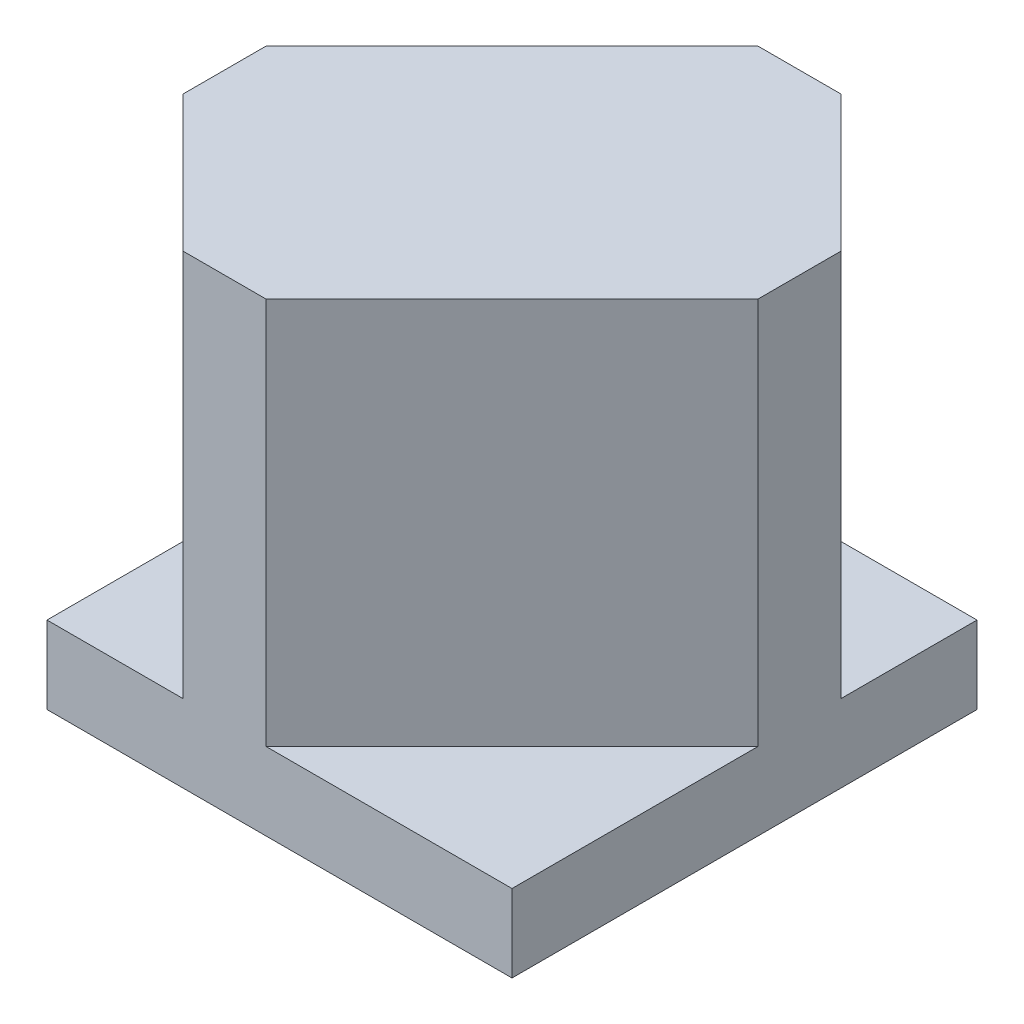
ISO-10303-21;
HEADER;
FILE_DESCRIPTION(('STEP AP214'),'2;1');
FILE_NAME('part.step','',(''),(''),'','','');
FILE_SCHEMA(('AUTOMOTIVE_DESIGN { 1 0 10303 214 1 1 1 1 }'));
ENDSEC;
DATA;
#1=APPLICATION_CONTEXT('core data for automotive mechanical design processes');
#2=APPLICATION_PROTOCOL_DEFINITION('international standard','automotive_design',2000,#1);
#3=PRODUCT_CONTEXT('',#1,'mechanical');
#4=PRODUCT('Part','Part','',(#3));
#5=PRODUCT_RELATED_PRODUCT_CATEGORY('part','',(#4));
#6=PRODUCT_DEFINITION_FORMATION('','',#4);
#7=PRODUCT_DEFINITION_CONTEXT('part definition',#1,'design');
#8=PRODUCT_DEFINITION('design','',#6,#7);
#9=PRODUCT_DEFINITION_SHAPE('','',#8);
#10=(LENGTH_UNIT() NAMED_UNIT(*) SI_UNIT(.MILLI.,.METRE.));
#11=(NAMED_UNIT(*) PLANE_ANGLE_UNIT() SI_UNIT($,.RADIAN.));
#12=(NAMED_UNIT(*) SI_UNIT($,.STERADIAN.) SOLID_ANGLE_UNIT());
#13=UNCERTAINTY_MEASURE_WITH_UNIT(LENGTH_MEASURE(1.E-05),#10,'distance_accuracy_value','');
#14=(GEOMETRIC_REPRESENTATION_CONTEXT(3) GLOBAL_UNCERTAINTY_ASSIGNED_CONTEXT((#13)) GLOBAL_UNIT_ASSIGNED_CONTEXT((#10,
#11,#12)) REPRESENTATION_CONTEXT('',''));
#15=CARTESIAN_POINT('',(0.,0.,0.));
#16=DIRECTION('',(0.,0.,1.));
#17=DIRECTION('',(1.,0.,0.));
#18=AXIS2_PLACEMENT_3D('',#15,#16,#17);
#19=CARTESIAN_POINT('',(30.,60.,0.));
#20=DIRECTION('',(-1.,0.,0.));
#21=DIRECTION('',(0.,0.,1.));
#22=AXIS2_PLACEMENT_3D('',#19,#20,#21);
#23=PLANE('',#22);
#24=DIRECTION('',(0.,0.,-1.));
#25=VECTOR('',#24,1.);
#26=CARTESIAN_POINT('',(30.,0.,0.));
#27=LINE('',#26,#25);
#28=CARTESIAN_POINT('',(30.,0.,30.));
#29=VERTEX_POINT('',#28);
#30=CARTESIAN_POINT('',(30.,0.,-30.));
#31=VERTEX_POINT('',#30);
#32=EDGE_CURVE('E275',#29,#31,#27,.T.);
#33=ORIENTED_EDGE('',*,*,#32,.T.);
#34=DIRECTION('',(0.,-1.,0.));
#35=VECTOR('',#34,1.);
#36=CARTESIAN_POINT('',(30.,10.,-30.));
#37=LINE('',#36,#35);
#38=CARTESIAN_POINT('',(30.,10.,-30.));
#39=VERTEX_POINT('',#38);
#40=EDGE_CURVE('E202',#39,#31,#37,.T.);
#41=ORIENTED_EDGE('',*,*,#40,.F.);
#42=DIRECTION('',(0.,0.,-1.));
#43=VECTOR('',#42,1.);
#44=CARTESIAN_POINT('',(30.,10.,0.));
#45=LINE('',#44,#43);
#46=CARTESIAN_POINT('',(30.,10.,-12.4264068711929));
#47=VERTEX_POINT('',#46);
#48=EDGE_CURVE('E203',#47,#39,#45,.T.);
#49=ORIENTED_EDGE('',*,*,#48,.F.);
#50=DIRECTION('',(0.,-1.,0.));
#51=VECTOR('',#50,1.);
#52=CARTESIAN_POINT('',(30.,60.,-12.4264068711929));
#53=LINE('',#52,#51);
#54=CARTESIAN_POINT('',(30.,60.,-12.4264068711929));
#55=VERTEX_POINT('',#54);
#56=EDGE_CURVE('E12',#55,#47,#53,.T.);
#57=ORIENTED_EDGE('',*,*,#56,.F.);
#58=DIRECTION('',(0.,0.,-1.));
#59=VECTOR('',#58,1.);
#60=CARTESIAN_POINT('',(30.,60.,0.));
#61=LINE('',#60,#59);
#62=CARTESIAN_POINT('',(30.,60.,-1.7157287525381));
#63=VERTEX_POINT('',#62);
#64=EDGE_CURVE('E249',#63,#55,#61,.T.);
#65=ORIENTED_EDGE('',*,*,#64,.F.);
#66=DIRECTION('',(0.,-1.,0.));
#67=VECTOR('',#66,1.);
#68=CARTESIAN_POINT('',(30.,60.,-1.7157287525381));
#69=LINE('',#68,#67);
#70=CARTESIAN_POINT('',(30.,10.,-1.7157287525381));
#71=VERTEX_POINT('',#70);
#72=EDGE_CURVE('E246',#63,#71,#69,.T.);
#73=ORIENTED_EDGE('',*,*,#72,.T.);
#74=DIRECTION('',(0.,0.,-1.));
#75=VECTOR('',#74,1.);
#76=CARTESIAN_POINT('',(30.,10.,0.));
#77=LINE('',#76,#75);
#78=CARTESIAN_POINT('',(30.,10.,30.));
#79=VERTEX_POINT('',#78);
#80=EDGE_CURVE('E224',#79,#71,#77,.T.);
#81=ORIENTED_EDGE('',*,*,#80,.F.);
#82=DIRECTION('',(0.,-1.,0.));
#83=VECTOR('',#82,1.);
#84=CARTESIAN_POINT('',(30.,10.,30.));
#85=LINE('',#84,#83);
#86=EDGE_CURVE('E214',#79,#29,#85,.T.);
#87=ORIENTED_EDGE('',*,*,#86,.T.);
#88=EDGE_LOOP('',(#33,#41,#49,#57,#65,#73,#81,#87));
#89=FACE_BOUND('',#88,.T.);
#90=ADVANCED_FACE('F53',(#89),#23,.F.);
#91=CARTESIAN_POINT('',(21.2132034355964,60.,-21.2132034355964));
#92=DIRECTION('',(-0.707106781186547,0.,0.707106781186548));
#93=DIRECTION('',(0.707106781186548,0.,0.707106781186547));
#94=AXIS2_PLACEMENT_3D('',#91,#92,#93);
#95=PLANE('',#94);
#96=ORIENTED_EDGE('',*,*,#56,.T.);
#97=DIRECTION('',(-0.707106781186548,0.,-0.707106781186547));
#98=VECTOR('',#97,1.);
#99=CARTESIAN_POINT('',(21.2132034355964,10.,-21.2132034355964));
#100=LINE('',#99,#98);
#101=CARTESIAN_POINT('',(12.4264068711929,10.,-30.));
#102=VERTEX_POINT('',#101);
#103=EDGE_CURVE('E165',#47,#102,#100,.T.);
#104=ORIENTED_EDGE('',*,*,#103,.T.);
#105=DIRECTION('',(0.,-1.,0.));
#106=VECTOR('',#105,1.);
#107=CARTESIAN_POINT('',(12.4264068711929,60.,-30.));
#108=LINE('',#107,#106);
#109=CARTESIAN_POINT('',(12.4264068711929,60.,-30.));
#110=VERTEX_POINT('',#109);
#111=EDGE_CURVE('E61',#110,#102,#108,.T.);
#112=ORIENTED_EDGE('',*,*,#111,.F.);
#113=DIRECTION('',(-0.707106781186548,0.,-0.707106781186547));
#114=VECTOR('',#113,1.);
#115=CARTESIAN_POINT('',(21.2132034355964,60.,-21.2132034355964));
#116=LINE('',#115,#114);
#117=EDGE_CURVE('E277',#55,#110,#116,.T.);
#118=ORIENTED_EDGE('',*,*,#117,.F.);
#119=EDGE_LOOP('',(#96,#104,#112,#118));
#120=FACE_BOUND('',#119,.T.);
#121=ADVANCED_FACE('F296',(#120),#95,.F.);
#122=CARTESIAN_POINT('',(0.,60.,-30.));
#123=DIRECTION('',(0.,0.,-1.));
#124=DIRECTION('',(-1.,0.,0.));
#125=AXIS2_PLACEMENT_3D('',#122,#123,#124);
#126=PLANE('',#125);
#127=DIRECTION('',(1.,0.,0.));
#128=VECTOR('',#127,1.);
#129=CARTESIAN_POINT('',(0.,0.,-30.));
#130=LINE('',#129,#128);
#131=CARTESIAN_POINT('',(-30.,0.,-30.));
#132=VERTEX_POINT('',#131);
#133=EDGE_CURVE('E288',#132,#31,#130,.T.);
#134=ORIENTED_EDGE('',*,*,#133,.F.);
#135=DIRECTION('',(0.,-1.,0.));
#136=VECTOR('',#135,1.);
#137=CARTESIAN_POINT('',(-30.,10.,-30.));
#138=LINE('',#137,#136);
#139=CARTESIAN_POINT('',(-30.,10.,-30.));
#140=VERTEX_POINT('',#139);
#141=EDGE_CURVE('E163',#140,#132,#138,.T.);
#142=ORIENTED_EDGE('',*,*,#141,.F.);
#143=DIRECTION('',(1.,0.,0.));
#144=VECTOR('',#143,1.);
#145=CARTESIAN_POINT('',(0.,10.,-30.));
#146=LINE('',#145,#144);
#147=CARTESIAN_POINT('',(1.71572875253808,10.,-30.));
#148=VERTEX_POINT('',#147);
#149=EDGE_CURVE('E156',#140,#148,#146,.T.);
#150=ORIENTED_EDGE('',*,*,#149,.T.);
#151=DIRECTION('',(0.,-1.,0.));
#152=VECTOR('',#151,1.);
#153=CARTESIAN_POINT('',(1.71572875253808,60.,-30.));
#154=LINE('',#153,#152);
#155=CARTESIAN_POINT('',(1.71572875253808,60.,-30.));
#156=VERTEX_POINT('',#155);
#157=EDGE_CURVE('E142',#156,#148,#154,.T.);
#158=ORIENTED_EDGE('',*,*,#157,.F.);
#159=DIRECTION('',(1.,0.,0.));
#160=VECTOR('',#159,1.);
#161=CARTESIAN_POINT('',(0.,60.,-30.));
#162=LINE('',#161,#160);
#163=EDGE_CURVE('E279',#156,#110,#162,.T.);
#164=ORIENTED_EDGE('',*,*,#163,.T.);
#165=ORIENTED_EDGE('',*,*,#111,.T.);
#166=DIRECTION('',(1.,0.,0.));
#167=VECTOR('',#166,1.);
#168=CARTESIAN_POINT('',(0.,10.,-30.));
#169=LINE('',#168,#167);
#170=EDGE_CURVE('E77',#102,#39,#169,.T.);
#171=ORIENTED_EDGE('',*,*,#170,.T.);
#172=ORIENTED_EDGE('',*,*,#40,.T.);
#173=EDGE_LOOP('',(#134,#142,#150,#158,#164,#165,#171,#172));
#174=FACE_BOUND('',#173,.T.);
#175=ADVANCED_FACE('F161',(#174),#126,.T.);
#176=CARTESIAN_POINT('',(-14.142135623731,60.,-14.142135623731));
#177=DIRECTION('',(-0.707106781186548,0.,-0.707106781186547));
#178=DIRECTION('',(-0.707106781186547,0.,0.707106781186548));
#179=AXIS2_PLACEMENT_3D('',#176,#177,#178);
#180=PLANE('',#179);
#181=DIRECTION('',(0.707106781186547,0.,-0.707106781186548));
#182=VECTOR('',#181,1.);
#183=CARTESIAN_POINT('',(-14.142135623731,10.,-14.142135623731));
#184=LINE('',#183,#182);
#185=CARTESIAN_POINT('',(-30.,10.,1.71572875253812));
#186=VERTEX_POINT('',#185);
#187=EDGE_CURVE('E69',#186,#148,#184,.T.);
#188=ORIENTED_EDGE('',*,*,#187,.F.);
#189=DIRECTION('',(0.,-1.,0.));
#190=VECTOR('',#189,1.);
#191=CARTESIAN_POINT('',(-30.,60.,1.71572875253812));
#192=LINE('',#191,#190);
#193=CARTESIAN_POINT('',(-30.,60.,1.71572875253812));
#194=VERTEX_POINT('',#193);
#195=EDGE_CURVE('E150',#194,#186,#192,.T.);
#196=ORIENTED_EDGE('',*,*,#195,.F.);
#197=DIRECTION('',(0.707106781186547,0.,-0.707106781186548));
#198=VECTOR('',#197,1.);
#199=CARTESIAN_POINT('',(-14.142135623731,60.,-14.142135623731));
#200=LINE('',#199,#198);
#201=EDGE_CURVE('E145',#194,#156,#200,.T.);
#202=ORIENTED_EDGE('',*,*,#201,.T.);
#203=ORIENTED_EDGE('',*,*,#157,.T.);
#204=EDGE_LOOP('',(#188,#196,#202,#203));
#205=FACE_BOUND('',#204,.T.);
#206=ADVANCED_FACE('F143',(#205),#180,.T.);
#207=CARTESIAN_POINT('',(-30.,60.,0.));
#208=DIRECTION('',(-1.,0.,0.));
#209=DIRECTION('',(0.,0.,1.));
#210=AXIS2_PLACEMENT_3D('',#207,#208,#209);
#211=PLANE('',#210);
#212=DIRECTION('',(0.,0.,-1.));
#213=VECTOR('',#212,1.);
#214=CARTESIAN_POINT('',(-30.,0.,0.));
#215=LINE('',#214,#213);
#216=CARTESIAN_POINT('',(-30.,0.,30.));
#217=VERTEX_POINT('',#216);
#218=EDGE_CURVE('E289',#217,#132,#215,.T.);
#219=ORIENTED_EDGE('',*,*,#218,.F.);
#220=DIRECTION('',(0.,-1.,0.));
#221=VECTOR('',#220,1.);
#222=CARTESIAN_POINT('',(-30.,10.,30.));
#223=LINE('',#222,#221);
#224=CARTESIAN_POINT('',(-30.,10.,30.));
#225=VERTEX_POINT('',#224);
#226=EDGE_CURVE('E273',#225,#217,#223,.T.);
#227=ORIENTED_EDGE('',*,*,#226,.F.);
#228=DIRECTION('',(0.,0.,-1.));
#229=VECTOR('',#228,1.);
#230=CARTESIAN_POINT('',(-30.,10.,0.));
#231=LINE('',#230,#229);
#232=CARTESIAN_POINT('',(-30.,10.,12.4264068711929));
#233=VERTEX_POINT('',#232);
#234=EDGE_CURVE('E269',#225,#233,#231,.T.);
#235=ORIENTED_EDGE('',*,*,#234,.T.);
#236=DIRECTION('',(0.,-1.,0.));
#237=VECTOR('',#236,1.);
#238=CARTESIAN_POINT('',(-30.,60.,12.4264068711929));
#239=LINE('',#238,#237);
#240=CARTESIAN_POINT('',(-30.,60.,12.4264068711929));
#241=VERTEX_POINT('',#240);
#242=EDGE_CURVE('E176',#241,#233,#239,.T.);
#243=ORIENTED_EDGE('',*,*,#242,.F.);
#244=DIRECTION('',(0.,0.,-1.));
#245=VECTOR('',#244,1.);
#246=CARTESIAN_POINT('',(-30.,60.,0.));
#247=LINE('',#246,#245);
#248=EDGE_CURVE('E175',#241,#194,#247,.T.);
#249=ORIENTED_EDGE('',*,*,#248,.T.);
#250=ORIENTED_EDGE('',*,*,#195,.T.);
#251=DIRECTION('',(0.,0.,-1.));
#252=VECTOR('',#251,1.);
#253=CARTESIAN_POINT('',(-30.,10.,0.));
#254=LINE('',#253,#252);
#255=EDGE_CURVE('E158',#186,#140,#254,.T.);
#256=ORIENTED_EDGE('',*,*,#255,.T.);
#257=ORIENTED_EDGE('',*,*,#141,.T.);
#258=EDGE_LOOP('',(#219,#227,#235,#243,#249,#250,#256,#257));
#259=FACE_BOUND('',#258,.T.);
#260=ADVANCED_FACE('F172',(#259),#211,.T.);
#261=CARTESIAN_POINT('',(-21.2132034355964,60.,21.2132034355965));
#262=DIRECTION('',(-0.707106781186547,0.,0.707106781186548));
#263=DIRECTION('',(0.707106781186548,0.,0.707106781186547));
#264=AXIS2_PLACEMENT_3D('',#261,#262,#263);
#265=PLANE('',#264);
#266=DIRECTION('',(-0.707106781186548,0.,-0.707106781186547));
#267=VECTOR('',#266,1.);
#268=CARTESIAN_POINT('',(-21.2132034355964,10.,21.2132034355965));
#269=LINE('',#268,#267);
#270=CARTESIAN_POINT('',(-12.4264068711929,10.,30.));
#271=VERTEX_POINT('',#270);
#272=EDGE_CURVE('E266',#271,#233,#269,.T.);
#273=ORIENTED_EDGE('',*,*,#272,.F.);
#274=DIRECTION('',(0.,-1.,0.));
#275=VECTOR('',#274,1.);
#276=CARTESIAN_POINT('',(-12.4264068711929,60.,30.));
#277=LINE('',#276,#275);
#278=CARTESIAN_POINT('',(-12.4264068711929,60.,30.));
#279=VERTEX_POINT('',#278);
#280=EDGE_CURVE('E178',#279,#271,#277,.T.);
#281=ORIENTED_EDGE('',*,*,#280,.F.);
#282=DIRECTION('',(-0.707106781186548,0.,-0.707106781186547));
#283=VECTOR('',#282,1.);
#284=CARTESIAN_POINT('',(-21.2132034355964,60.,21.2132034355965));
#285=LINE('',#284,#283);
#286=EDGE_CURVE('E283',#279,#241,#285,.T.);
#287=ORIENTED_EDGE('',*,*,#286,.T.);
#288=ORIENTED_EDGE('',*,*,#242,.T.);
#289=EDGE_LOOP('',(#273,#281,#287,#288));
#290=FACE_BOUND('',#289,.T.);
#291=ADVANCED_FACE('F305',(#290),#265,.T.);
#292=CARTESIAN_POINT('',(0.,60.,30.));
#293=DIRECTION('',(0.,0.,-1.));
#294=DIRECTION('',(-1.,0.,0.));
#295=AXIS2_PLACEMENT_3D('',#292,#293,#294);
#296=PLANE('',#295);
#297=DIRECTION('',(1.,0.,0.));
#298=VECTOR('',#297,1.);
#299=CARTESIAN_POINT('',(0.,0.,30.));
#300=LINE('',#299,#298);
#301=EDGE_CURVE('E239',#217,#29,#300,.T.);
#302=ORIENTED_EDGE('',*,*,#301,.T.);
#303=ORIENTED_EDGE('',*,*,#86,.F.);
#304=DIRECTION('',(1.,0.,0.));
#305=VECTOR('',#304,1.);
#306=CARTESIAN_POINT('',(0.,10.,30.));
#307=LINE('',#306,#305);
#308=CARTESIAN_POINT('',(-1.71572875253808,10.,30.));
#309=VERTEX_POINT('',#308);
#310=EDGE_CURVE('E220',#309,#79,#307,.T.);
#311=ORIENTED_EDGE('',*,*,#310,.F.);
#312=DIRECTION('',(0.,-1.,0.));
#313=VECTOR('',#312,1.);
#314=CARTESIAN_POINT('',(-1.71572875253808,60.,30.));
#315=LINE('',#314,#313);
#316=CARTESIAN_POINT('',(-1.71572875253808,60.,30.));
#317=VERTEX_POINT('',#316);
#318=EDGE_CURVE('E221',#317,#309,#315,.T.);
#319=ORIENTED_EDGE('',*,*,#318,.F.);
#320=DIRECTION('',(1.,0.,0.));
#321=VECTOR('',#320,1.);
#322=CARTESIAN_POINT('',(0.,60.,30.));
#323=LINE('',#322,#321);
#324=EDGE_CURVE('E253',#279,#317,#323,.T.);
#325=ORIENTED_EDGE('',*,*,#324,.F.);
#326=ORIENTED_EDGE('',*,*,#280,.T.);
#327=DIRECTION('',(1.,0.,0.));
#328=VECTOR('',#327,1.);
#329=CARTESIAN_POINT('',(0.,10.,30.));
#330=LINE('',#329,#328);
#331=EDGE_CURVE('E242',#225,#271,#330,.T.);
#332=ORIENTED_EDGE('',*,*,#331,.F.);
#333=ORIENTED_EDGE('',*,*,#226,.T.);
#334=EDGE_LOOP('',(#302,#303,#311,#319,#325,#326,#332,#333));
#335=FACE_BOUND('',#334,.T.);
#336=ADVANCED_FACE('F237',(#335),#296,.F.);
#337=CARTESIAN_POINT('',(14.142135623731,60.,14.142135623731));
#338=DIRECTION('',(-0.707106781186548,0.,-0.707106781186547));
#339=DIRECTION('',(-0.707106781186547,0.,0.707106781186548));
#340=AXIS2_PLACEMENT_3D('',#337,#338,#339);
#341=PLANE('',#340);
#342=ORIENTED_EDGE('',*,*,#318,.T.);
#343=DIRECTION('',(0.707106781186547,0.,-0.707106781186548));
#344=VECTOR('',#343,1.);
#345=CARTESIAN_POINT('',(14.142135623731,10.,14.142135623731));
#346=LINE('',#345,#344);
#347=EDGE_CURVE('E211',#309,#71,#346,.T.);
#348=ORIENTED_EDGE('',*,*,#347,.T.);
#349=ORIENTED_EDGE('',*,*,#72,.F.);
#350=DIRECTION('',(0.707106781186547,0.,-0.707106781186548));
#351=VECTOR('',#350,1.);
#352=CARTESIAN_POINT('',(14.142135623731,60.,14.142135623731));
#353=LINE('',#352,#351);
#354=EDGE_CURVE('E252',#317,#63,#353,.T.);
#355=ORIENTED_EDGE('',*,*,#354,.F.);
#356=EDGE_LOOP('',(#342,#348,#349,#355));
#357=FACE_BOUND('',#356,.T.);
#358=ADVANCED_FACE('F301',(#357),#341,.F.);
#359=CARTESIAN_POINT('',(0.,60.,0.));
#360=DIRECTION('',(0.,1.,0.));
#361=DIRECTION('',(0.,0.,1.));
#362=AXIS2_PLACEMENT_3D('',#359,#360,#361);
#363=PLANE('',#362);
#364=ORIENTED_EDGE('',*,*,#64,.T.);
#365=ORIENTED_EDGE('',*,*,#117,.T.);
#366=ORIENTED_EDGE('',*,*,#163,.F.);
#367=ORIENTED_EDGE('',*,*,#201,.F.);
#368=ORIENTED_EDGE('',*,*,#248,.F.);
#369=ORIENTED_EDGE('',*,*,#286,.F.);
#370=ORIENTED_EDGE('',*,*,#324,.T.);
#371=ORIENTED_EDGE('',*,*,#354,.T.);
#372=EDGE_LOOP('',(#364,#365,#366,#367,#368,#369,#370,#371));
#373=FACE_BOUND('',#372,.T.);
#374=ADVANCED_FACE('F298',(#373),#363,.T.);
#375=CARTESIAN_POINT('',(0.,0.,0.));
#376=DIRECTION('',(0.,1.,0.));
#377=DIRECTION('',(0.,0.,1.));
#378=AXIS2_PLACEMENT_3D('',#375,#376,#377);
#379=PLANE('',#378);
#380=ORIENTED_EDGE('',*,*,#32,.F.);
#381=ORIENTED_EDGE('',*,*,#301,.F.);
#382=ORIENTED_EDGE('',*,*,#218,.T.);
#383=ORIENTED_EDGE('',*,*,#133,.T.);
#384=EDGE_LOOP('',(#380,#381,#382,#383));
#385=FACE_BOUND('',#384,.T.);
#386=ADVANCED_FACE('F291',(#385),#379,.F.);
#387=CARTESIAN_POINT('',(0.,10.,0.));
#388=DIRECTION('',(0.,1.,0.));
#389=DIRECTION('',(0.,0.,1.));
#390=AXIS2_PLACEMENT_3D('',#387,#388,#389);
#391=PLANE('',#390);
#392=ORIENTED_EDGE('',*,*,#331,.T.);
#393=ORIENTED_EDGE('',*,*,#272,.T.);
#394=ORIENTED_EDGE('',*,*,#234,.F.);
#395=EDGE_LOOP('',(#392,#393,#394));
#396=FACE_BOUND('',#395,.T.);
#397=ADVANCED_FACE('F309',(#396),#391,.T.);
#398=CARTESIAN_POINT('',(0.,10.,0.));
#399=DIRECTION('',(0.,1.,0.));
#400=DIRECTION('',(0.,0.,1.));
#401=AXIS2_PLACEMENT_3D('',#398,#399,#400);
#402=PLANE('',#401);
#403=ORIENTED_EDGE('',*,*,#347,.F.);
#404=ORIENTED_EDGE('',*,*,#310,.T.);
#405=ORIENTED_EDGE('',*,*,#80,.T.);
#406=EDGE_LOOP('',(#403,#404,#405));
#407=FACE_BOUND('',#406,.T.);
#408=ADVANCED_FACE('F230',(#407),#402,.T.);
#409=CARTESIAN_POINT('',(0.,10.,0.));
#410=DIRECTION('',(0.,1.,0.));
#411=DIRECTION('',(0.,0.,1.));
#412=AXIS2_PLACEMENT_3D('',#409,#410,#411);
#413=PLANE('',#412);
#414=ORIENTED_EDGE('',*,*,#103,.F.);
#415=ORIENTED_EDGE('',*,*,#48,.T.);
#416=ORIENTED_EDGE('',*,*,#170,.F.);
#417=EDGE_LOOP('',(#414,#415,#416));
#418=FACE_BOUND('',#417,.T.);
#419=ADVANCED_FACE('F293',(#418),#413,.T.);
#420=CARTESIAN_POINT('',(0.,10.,0.));
#421=DIRECTION('',(0.,1.,0.));
#422=DIRECTION('',(0.,0.,1.));
#423=AXIS2_PLACEMENT_3D('',#420,#421,#422);
#424=PLANE('',#423);
#425=ORIENTED_EDGE('',*,*,#255,.F.);
#426=ORIENTED_EDGE('',*,*,#187,.T.);
#427=ORIENTED_EDGE('',*,*,#149,.F.);
#428=EDGE_LOOP('',(#425,#426,#427));
#429=FACE_BOUND('',#428,.T.);
#430=ADVANCED_FACE('F155',(#429),#424,.T.);
#431=CLOSED_SHELL('',(#90,#121,#175,#206,#260,#291,#336,#358,#374,#386,#397,#408,#419,#430));
#432=MANIFOLD_SOLID_BREP('B2',#431);
#433=ADVANCED_BREP_SHAPE_REPRESENTATION('',(#18,#432),#14);
#434=SHAPE_DEFINITION_REPRESENTATION(#9,#433);
ENDSEC;
END-ISO-10303-21;
